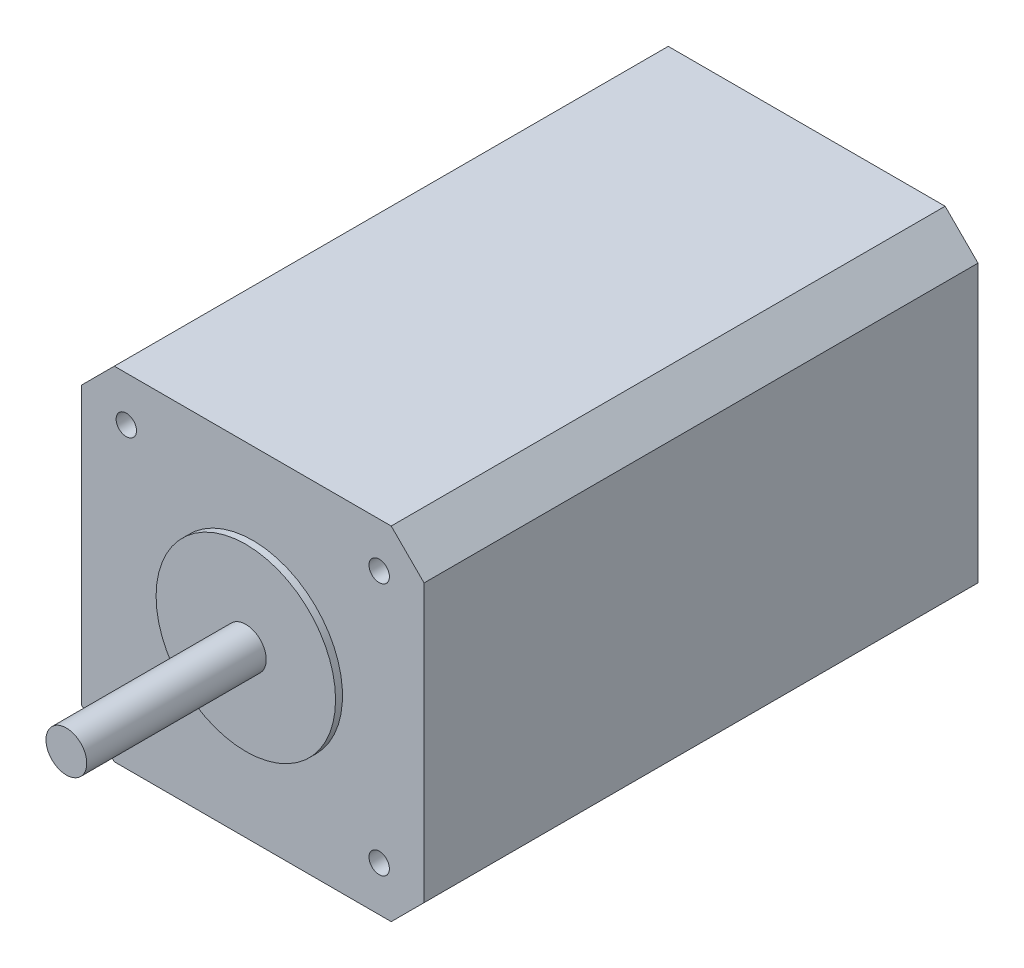
ISO-10303-21;
HEADER;
FILE_DESCRIPTION(('STEP AP214'),'2;1');
FILE_NAME('part.step','',(''),(''),'','','');
FILE_SCHEMA(('AUTOMOTIVE_DESIGN { 1 0 10303 214 1 1 1 1 }'));
ENDSEC;
DATA;
#1=APPLICATION_CONTEXT('core data for automotive mechanical design processes');
#2=APPLICATION_PROTOCOL_DEFINITION('international standard','automotive_design',2000,#1);
#3=PRODUCT_CONTEXT('',#1,'mechanical');
#4=PRODUCT('Part','Part','',(#3));
#5=PRODUCT_RELATED_PRODUCT_CATEGORY('part','',(#4));
#6=PRODUCT_DEFINITION_FORMATION('','',#4);
#7=PRODUCT_DEFINITION_CONTEXT('part definition',#1,'design');
#8=PRODUCT_DEFINITION('design','',#6,#7);
#9=PRODUCT_DEFINITION_SHAPE('','',#8);
#10=(LENGTH_UNIT() NAMED_UNIT(*) SI_UNIT(.MILLI.,.METRE.));
#11=(NAMED_UNIT(*) PLANE_ANGLE_UNIT() SI_UNIT($,.RADIAN.));
#12=(NAMED_UNIT(*) SI_UNIT($,.STERADIAN.) SOLID_ANGLE_UNIT());
#13=UNCERTAINTY_MEASURE_WITH_UNIT(LENGTH_MEASURE(1.E-05),#10,'distance_accuracy_value','');
#14=(GEOMETRIC_REPRESENTATION_CONTEXT(3) GLOBAL_UNCERTAINTY_ASSIGNED_CONTEXT((#13)) GLOBAL_UNIT_ASSIGNED_CONTEXT((#10,
#11,#12)) REPRESENTATION_CONTEXT('',''));
#15=CARTESIAN_POINT('',(0.,0.,0.));
#16=DIRECTION('',(0.,0.,1.));
#17=DIRECTION('',(1.,0.,0.));
#18=AXIS2_PLACEMENT_3D('',#15,#16,#17);
#19=CARTESIAN_POINT('',(0.,0.,33.95));
#20=DIRECTION('',(0.,0.,-1.));
#21=DIRECTION('',(-1.,0.,0.));
#22=AXIS2_PLACEMENT_3D('',#19,#20,#21);
#23=PLANE('',#22);
#24=CARTESIAN_POINT('',(-15.5,-15.5,33.95));
#25=DIRECTION('',(0.,0.,1.));
#26=DIRECTION('',(1.,0.,0.));
#27=AXIS2_PLACEMENT_3D('',#24,#25,#26);
#28=CIRCLE('',#27,1.24999999999999);
#29=CARTESIAN_POINT('',(-14.25,-15.5,33.95));
#30=VERTEX_POINT('',#29);
#31=EDGE_CURVE('E167',#30,#30,#28,.T.);
#32=ORIENTED_EDGE('',*,*,#31,.F.);
#33=EDGE_LOOP('',(#32));
#34=FACE_BOUND('',#33,.T.);
#35=CARTESIAN_POINT('',(0.,0.,33.95));
#36=DIRECTION('',(0.,0.,-1.));
#37=DIRECTION('',(-1.,0.,0.));
#38=AXIS2_PLACEMENT_3D('',#35,#36,#37);
#39=CIRCLE('',#38,11.);
#40=CARTESIAN_POINT('',(-11.,0.,33.95));
#41=VERTEX_POINT('',#40);
#42=EDGE_CURVE('E207',#41,#41,#39,.F.);
#43=ORIENTED_EDGE('',*,*,#42,.F.);
#44=EDGE_LOOP('',(#43));
#45=FACE_BOUND('',#44,.T.);
#46=DIRECTION('',(-0.707106781186552,-0.707106781186543,0.));
#47=VECTOR('',#46,1.);
#48=CARTESIAN_POINT('',(-37.9716341497178,0.,33.95));
#49=LINE('',#48,#47);
#50=CARTESIAN_POINT('',(-16.9716341497176,21.,33.95));
#51=VERTEX_POINT('',#50);
#52=CARTESIAN_POINT('',(-21.,16.9716341497176,33.95));
#53=VERTEX_POINT('',#52);
#54=EDGE_CURVE('E173',#51,#53,#49,.T.);
#55=ORIENTED_EDGE('',*,*,#54,.T.);
#56=DIRECTION('',(0.,-1.,0.));
#57=VECTOR('',#56,1.);
#58=CARTESIAN_POINT('',(-21.,-21.,33.95));
#59=LINE('',#58,#57);
#60=CARTESIAN_POINT('',(-21.,-16.9716341497176,33.95));
#61=VERTEX_POINT('',#60);
#62=EDGE_CURVE('E218',#53,#61,#59,.T.);
#63=ORIENTED_EDGE('',*,*,#62,.T.);
#64=DIRECTION('',(0.707106781186552,-0.707106781186543,0.));
#65=VECTOR('',#64,1.);
#66=CARTESIAN_POINT('',(0.,-37.9716341497174,33.95));
#67=LINE('',#66,#65);
#68=CARTESIAN_POINT('',(-16.9716341497176,-21.,33.95));
#69=VERTEX_POINT('',#68);
#70=EDGE_CURVE('E176',#61,#69,#67,.T.);
#71=ORIENTED_EDGE('',*,*,#70,.T.);
#72=DIRECTION('',(1.,0.,0.));
#73=VECTOR('',#72,1.);
#74=CARTESIAN_POINT('',(-21.,-21.,33.95));
#75=LINE('',#74,#73);
#76=CARTESIAN_POINT('',(16.9716341497176,-21.,33.95));
#77=VERTEX_POINT('',#76);
#78=EDGE_CURVE('E221',#69,#77,#75,.T.);
#79=ORIENTED_EDGE('',*,*,#78,.T.);
#80=DIRECTION('',(0.707106781186552,0.707106781186543,0.));
#81=VECTOR('',#80,1.);
#82=CARTESIAN_POINT('',(0.,-37.9716341497174,33.95));
#83=LINE('',#82,#81);
#84=CARTESIAN_POINT('',(21.,-16.9716341497176,33.95));
#85=VERTEX_POINT('',#84);
#86=EDGE_CURVE('E179',#77,#85,#83,.T.);
#87=ORIENTED_EDGE('',*,*,#86,.T.);
#88=DIRECTION('',(0.,1.,0.));
#89=VECTOR('',#88,1.);
#90=CARTESIAN_POINT('',(21.,-21.,33.95));
#91=LINE('',#90,#89);
#92=CARTESIAN_POINT('',(21.,16.9716341497176,33.95));
#93=VERTEX_POINT('',#92);
#94=EDGE_CURVE('E211',#85,#93,#91,.T.);
#95=ORIENTED_EDGE('',*,*,#94,.T.);
#96=DIRECTION('',(-0.707106781186552,0.707106781186543,0.));
#97=VECTOR('',#96,1.);
#98=CARTESIAN_POINT('',(37.9716341497178,0.,33.95));
#99=LINE('',#98,#97);
#100=CARTESIAN_POINT('',(16.9716341497176,21.,33.95));
#101=VERTEX_POINT('',#100);
#102=EDGE_CURVE('E182',#93,#101,#99,.T.);
#103=ORIENTED_EDGE('',*,*,#102,.T.);
#104=DIRECTION('',(-1.,0.,0.));
#105=VECTOR('',#104,1.);
#106=CARTESIAN_POINT('',(-21.,21.,33.95));
#107=LINE('',#106,#105);
#108=EDGE_CURVE('E214',#101,#51,#107,.T.);
#109=ORIENTED_EDGE('',*,*,#108,.T.);
#110=EDGE_LOOP('',(#55,#63,#71,#79,#87,#95,#103,#109));
#111=FACE_BOUND('',#110,.T.);
#112=CARTESIAN_POINT('',(15.5,15.5,33.95));
#113=DIRECTION('',(0.,0.,1.));
#114=DIRECTION('',(1.,0.,0.));
#115=AXIS2_PLACEMENT_3D('',#112,#113,#114);
#116=CIRCLE('',#115,1.24999999999999);
#117=CARTESIAN_POINT('',(16.75,15.5,33.95));
#118=VERTEX_POINT('',#117);
#119=EDGE_CURVE('E161',#118,#118,#116,.T.);
#120=ORIENTED_EDGE('',*,*,#119,.F.);
#121=EDGE_LOOP('',(#120));
#122=FACE_BOUND('',#121,.T.);
#123=CARTESIAN_POINT('',(15.5,-15.5,33.95));
#124=DIRECTION('',(0.,0.,1.));
#125=DIRECTION('',(1.,0.,0.));
#126=AXIS2_PLACEMENT_3D('',#123,#124,#125);
#127=CIRCLE('',#126,1.24999999999999);
#128=CARTESIAN_POINT('',(16.75,-15.5,33.95));
#129=VERTEX_POINT('',#128);
#130=EDGE_CURVE('E150',#129,#129,#127,.T.);
#131=ORIENTED_EDGE('',*,*,#130,.F.);
#132=EDGE_LOOP('',(#131));
#133=FACE_BOUND('',#132,.T.);
#134=CARTESIAN_POINT('',(-15.5,15.5,33.95));
#135=DIRECTION('',(0.,0.,1.));
#136=DIRECTION('',(1.,0.,0.));
#137=AXIS2_PLACEMENT_3D('',#134,#135,#136);
#138=CIRCLE('',#137,1.24999999999999);
#139=CARTESIAN_POINT('',(-14.25,15.5,33.95));
#140=VERTEX_POINT('',#139);
#141=EDGE_CURVE('E151',#140,#140,#138,.T.);
#142=ORIENTED_EDGE('',*,*,#141,.F.);
#143=EDGE_LOOP('',(#142));
#144=FACE_BOUND('',#143,.T.);
#145=ADVANCED_FACE('F66',(#34,#45,#111,#122,#133,#144),#23,.F.);
#146=CARTESIAN_POINT('',(21.,-21.,33.95));
#147=DIRECTION('',(-1.,0.,0.));
#148=DIRECTION('',(0.,0.,1.));
#149=AXIS2_PLACEMENT_3D('',#146,#147,#148);
#150=PLANE('',#149);
#151=DIRECTION('',(0.,0.,-1.));
#152=VECTOR('',#151,1.);
#153=CARTESIAN_POINT('',(21.,16.9716341497176,33.95));
#154=LINE('',#153,#152);
#155=CARTESIAN_POINT('',(21.,16.9716341497176,-33.95));
#156=VERTEX_POINT('',#155);
#157=EDGE_CURVE('E194',#93,#156,#154,.T.);
#158=ORIENTED_EDGE('',*,*,#157,.F.);
#159=ORIENTED_EDGE('',*,*,#94,.F.);
#160=DIRECTION('',(0.,0.,1.));
#161=VECTOR('',#160,1.);
#162=CARTESIAN_POINT('',(21.,-16.9716341497176,33.95));
#163=LINE('',#162,#161);
#164=CARTESIAN_POINT('',(21.,-16.9716341497176,-33.95));
#165=VERTEX_POINT('',#164);
#166=EDGE_CURVE('E190',#165,#85,#163,.T.);
#167=ORIENTED_EDGE('',*,*,#166,.F.);
#168=DIRECTION('',(0.,1.,0.));
#169=VECTOR('',#168,1.);
#170=CARTESIAN_POINT('',(21.,-21.,-33.95));
#171=LINE('',#170,#169);
#172=EDGE_CURVE('E210',#165,#156,#171,.T.);
#173=ORIENTED_EDGE('',*,*,#172,.T.);
#174=EDGE_LOOP('',(#158,#159,#167,#173));
#175=FACE_BOUND('',#174,.T.);
#176=ADVANCED_FACE('F68',(#175),#150,.F.);
#177=CARTESIAN_POINT('',(-21.,21.,33.95));
#178=DIRECTION('',(0.,-1.,0.));
#179=DIRECTION('',(0.,0.,-1.));
#180=AXIS2_PLACEMENT_3D('',#177,#178,#179);
#181=PLANE('',#180);
#182=DIRECTION('',(0.,0.,-1.));
#183=VECTOR('',#182,1.);
#184=CARTESIAN_POINT('',(-16.9716341497176,21.,33.95));
#185=LINE('',#184,#183);
#186=CARTESIAN_POINT('',(-16.9716341497176,21.,-33.95));
#187=VERTEX_POINT('',#186);
#188=EDGE_CURVE('E81',#51,#187,#185,.T.);
#189=ORIENTED_EDGE('',*,*,#188,.F.);
#190=ORIENTED_EDGE('',*,*,#108,.F.);
#191=DIRECTION('',(0.,0.,1.));
#192=VECTOR('',#191,1.);
#193=CARTESIAN_POINT('',(16.9716341497176,21.,33.95));
#194=LINE('',#193,#192);
#195=CARTESIAN_POINT('',(16.9716341497176,21.,-33.95));
#196=VERTEX_POINT('',#195);
#197=EDGE_CURVE('E192',#196,#101,#194,.T.);
#198=ORIENTED_EDGE('',*,*,#197,.F.);
#199=DIRECTION('',(-1.,0.,0.));
#200=VECTOR('',#199,1.);
#201=CARTESIAN_POINT('',(-21.,21.,-33.95));
#202=LINE('',#201,#200);
#203=EDGE_CURVE('E226',#196,#187,#202,.T.);
#204=ORIENTED_EDGE('',*,*,#203,.T.);
#205=EDGE_LOOP('',(#189,#190,#198,#204));
#206=FACE_BOUND('',#205,.T.);
#207=ADVANCED_FACE('F268',(#206),#181,.F.);
#208=CARTESIAN_POINT('',(-21.,-21.,33.95));
#209=DIRECTION('',(1.,0.,0.));
#210=DIRECTION('',(0.,0.,-1.));
#211=AXIS2_PLACEMENT_3D('',#208,#209,#210);
#212=PLANE('',#211);
#213=DIRECTION('',(0.,0.,1.));
#214=VECTOR('',#213,1.);
#215=CARTESIAN_POINT('',(-21.,16.9716341497176,33.95));
#216=LINE('',#215,#214);
#217=CARTESIAN_POINT('',(-21.,16.9716341497176,-33.95));
#218=VERTEX_POINT('',#217);
#219=EDGE_CURVE('E196',#218,#53,#216,.T.);
#220=ORIENTED_EDGE('',*,*,#219,.F.);
#221=DIRECTION('',(0.,-1.,0.));
#222=VECTOR('',#221,1.);
#223=CARTESIAN_POINT('',(-21.,-21.,-33.95));
#224=LINE('',#223,#222);
#225=CARTESIAN_POINT('',(-21.,-16.9716341497176,-33.95));
#226=VERTEX_POINT('',#225);
#227=EDGE_CURVE('E229',#218,#226,#224,.T.);
#228=ORIENTED_EDGE('',*,*,#227,.T.);
#229=DIRECTION('',(0.,0.,-1.));
#230=VECTOR('',#229,1.);
#231=CARTESIAN_POINT('',(-21.,-16.9716341497176,33.95));
#232=LINE('',#231,#230);
#233=EDGE_CURVE('E88',#61,#226,#232,.T.);
#234=ORIENTED_EDGE('',*,*,#233,.F.);
#235=ORIENTED_EDGE('',*,*,#62,.F.);
#236=EDGE_LOOP('',(#220,#228,#234,#235));
#237=FACE_BOUND('',#236,.T.);
#238=ADVANCED_FACE('F263',(#237),#212,.F.);
#239=CARTESIAN_POINT('',(-21.,-21.,33.95));
#240=DIRECTION('',(0.,1.,0.));
#241=DIRECTION('',(0.,0.,1.));
#242=AXIS2_PLACEMENT_3D('',#239,#240,#241);
#243=PLANE('',#242);
#244=DIRECTION('',(0.,0.,-1.));
#245=VECTOR('',#244,1.);
#246=CARTESIAN_POINT('',(16.9716341497176,-21.,33.95));
#247=LINE('',#246,#245);
#248=CARTESIAN_POINT('',(16.9716341497176,-21.,-33.95));
#249=VERTEX_POINT('',#248);
#250=EDGE_CURVE('E188',#77,#249,#247,.T.);
#251=ORIENTED_EDGE('',*,*,#250,.F.);
#252=ORIENTED_EDGE('',*,*,#78,.F.);
#253=DIRECTION('',(0.,0.,1.));
#254=VECTOR('',#253,1.);
#255=CARTESIAN_POINT('',(-16.9716341497176,-21.,33.95));
#256=LINE('',#255,#254);
#257=CARTESIAN_POINT('',(-16.9716341497176,-21.,-33.95));
#258=VERTEX_POINT('',#257);
#259=EDGE_CURVE('E185',#258,#69,#256,.T.);
#260=ORIENTED_EDGE('',*,*,#259,.F.);
#261=DIRECTION('',(1.,0.,0.));
#262=VECTOR('',#261,1.);
#263=CARTESIAN_POINT('',(-21.,-21.,-33.95));
#264=LINE('',#263,#262);
#265=EDGE_CURVE('E215',#258,#249,#264,.T.);
#266=ORIENTED_EDGE('',*,*,#265,.T.);
#267=EDGE_LOOP('',(#251,#252,#260,#266));
#268=FACE_BOUND('',#267,.T.);
#269=ADVANCED_FACE('F259',(#268),#243,.F.);
#270=CARTESIAN_POINT('',(0.,0.,-33.95));
#271=DIRECTION('',(0.,0.,-1.));
#272=DIRECTION('',(-1.,0.,0.));
#273=AXIS2_PLACEMENT_3D('',#270,#271,#272);
#274=PLANE('',#273);
#275=ORIENTED_EDGE('',*,*,#227,.F.);
#276=DIRECTION('',(0.707106781186552,0.707106781186543,0.));
#277=VECTOR('',#276,1.);
#278=CARTESIAN_POINT('',(-18.9858170748587,18.9858170748589,-33.95));
#279=LINE('',#278,#277);
#280=EDGE_CURVE('E12',#218,#187,#279,.T.);
#281=ORIENTED_EDGE('',*,*,#280,.T.);
#282=ORIENTED_EDGE('',*,*,#203,.F.);
#283=DIRECTION('',(0.707106781186552,-0.707106781186543,0.));
#284=VECTOR('',#283,1.);
#285=CARTESIAN_POINT('',(18.9858170748587,18.9858170748589,-33.95));
#286=LINE('',#285,#284);
#287=EDGE_CURVE('E74',#196,#156,#286,.T.);
#288=ORIENTED_EDGE('',*,*,#287,.T.);
#289=ORIENTED_EDGE('',*,*,#172,.F.);
#290=DIRECTION('',(-0.707106781186552,-0.707106781186544,0.));
#291=VECTOR('',#290,1.);
#292=CARTESIAN_POINT('',(18.9858170748587,-18.9858170748589,-33.95));
#293=LINE('',#292,#291);
#294=EDGE_CURVE('E237',#165,#249,#293,.T.);
#295=ORIENTED_EDGE('',*,*,#294,.T.);
#296=ORIENTED_EDGE('',*,*,#265,.F.);
#297=DIRECTION('',(-0.707106781186552,0.707106781186544,0.));
#298=VECTOR('',#297,1.);
#299=CARTESIAN_POINT('',(-18.9858170748587,-18.9858170748589,-33.95));
#300=LINE('',#299,#298);
#301=EDGE_CURVE('E206',#258,#226,#300,.T.);
#302=ORIENTED_EDGE('',*,*,#301,.T.);
#303=EDGE_LOOP('',(#275,#281,#282,#288,#289,#295,#296,#302));
#304=FACE_BOUND('',#303,.T.);
#305=ADVANCED_FACE('F244',(#304),#274,.T.);
#306=CARTESIAN_POINT('',(0.,0.,34.8));
#307=DIRECTION('',(0.,0.,-1.));
#308=DIRECTION('',(-1.,0.,0.));
#309=AXIS2_PLACEMENT_3D('',#306,#307,#308);
#310=CYLINDRICAL_SURFACE('',#309,11.);
#311=CARTESIAN_POINT('',(0.,0.,34.8));
#312=DIRECTION('',(0.,0.,1.));
#313=DIRECTION('',(1.,0.,0.));
#314=AXIS2_PLACEMENT_3D('',#311,#312,#313);
#315=CIRCLE('',#314,11.);
#316=CARTESIAN_POINT('',(11.,0.,34.8));
#317=VERTEX_POINT('',#316);
#318=EDGE_CURVE('E202',#317,#317,#315,.T.);
#319=ORIENTED_EDGE('',*,*,#318,.F.);
#320=EDGE_LOOP('',(#319));
#321=FACE_BOUND('',#320,.T.);
#322=ORIENTED_EDGE('',*,*,#42,.T.);
#323=EDGE_LOOP('',(#322));
#324=FACE_BOUND('',#323,.T.);
#325=ADVANCED_FACE('F291',(#321,#324),#310,.T.);
#326=CARTESIAN_POINT('',(0.,0.,34.8));
#327=DIRECTION('',(0.,0.,1.));
#328=DIRECTION('',(1.,0.,0.));
#329=AXIS2_PLACEMENT_3D('',#326,#327,#328);
#330=PLANE('',#329);
#331=CARTESIAN_POINT('',(0.,0.,34.8));
#332=DIRECTION('',(0.,0.,1.));
#333=DIRECTION('',(1.,0.,0.));
#334=AXIS2_PLACEMENT_3D('',#331,#332,#333);
#335=CIRCLE('',#334,2.5);
#336=CARTESIAN_POINT('',(2.5,0.,34.8));
#337=VERTEX_POINT('',#336);
#338=EDGE_CURVE('E203',#337,#337,#335,.T.);
#339=ORIENTED_EDGE('',*,*,#338,.F.);
#340=EDGE_LOOP('',(#339));
#341=FACE_BOUND('',#340,.T.);
#342=ORIENTED_EDGE('',*,*,#318,.T.);
#343=EDGE_LOOP('',(#342));
#344=FACE_BOUND('',#343,.T.);
#345=ADVANCED_FACE('F321',(#341,#344),#330,.T.);
#346=CARTESIAN_POINT('',(0.,0.,56.8));
#347=DIRECTION('',(0.,0.,-1.));
#348=DIRECTION('',(-1.,0.,0.));
#349=AXIS2_PLACEMENT_3D('',#346,#347,#348);
#350=CYLINDRICAL_SURFACE('',#349,2.5);
#351=CARTESIAN_POINT('',(0.,0.,56.8));
#352=DIRECTION('',(0.,0.,1.));
#353=DIRECTION('',(1.,0.,0.));
#354=AXIS2_PLACEMENT_3D('',#351,#352,#353);
#355=CIRCLE('',#354,2.5);
#356=CARTESIAN_POINT('',(2.5,0.,56.8));
#357=VERTEX_POINT('',#356);
#358=EDGE_CURVE('E199',#357,#357,#355,.T.);
#359=ORIENTED_EDGE('',*,*,#358,.F.);
#360=EDGE_LOOP('',(#359));
#361=FACE_BOUND('',#360,.T.);
#362=ORIENTED_EDGE('',*,*,#338,.T.);
#363=EDGE_LOOP('',(#362));
#364=FACE_BOUND('',#363,.T.);
#365=ADVANCED_FACE('F328',(#361,#364),#350,.T.);
#366=CARTESIAN_POINT('',(0.,0.,56.8));
#367=DIRECTION('',(0.,0.,1.));
#368=DIRECTION('',(1.,0.,0.));
#369=AXIS2_PLACEMENT_3D('',#366,#367,#368);
#370=PLANE('',#369);
#371=ORIENTED_EDGE('',*,*,#358,.T.);
#372=EDGE_LOOP('',(#371));
#373=FACE_BOUND('',#372,.T.);
#374=ADVANCED_FACE('F335',(#373),#370,.T.);
#375=CARTESIAN_POINT('',(0.,-37.9716341497174,-33.95));
#376=DIRECTION('',(-0.707106781186544,-0.707106781186552,0.));
#377=DIRECTION('',(0.707106781186552,-0.707106781186544,0.));
#378=AXIS2_PLACEMENT_3D('',#375,#376,#377);
#379=PLANE('',#378);
#380=ORIENTED_EDGE('',*,*,#233,.T.);
#381=ORIENTED_EDGE('',*,*,#301,.F.);
#382=ORIENTED_EDGE('',*,*,#259,.T.);
#383=ORIENTED_EDGE('',*,*,#70,.F.);
#384=EDGE_LOOP('',(#380,#381,#382,#383));
#385=FACE_BOUND('',#384,.T.);
#386=ADVANCED_FACE('F278',(#385),#379,.T.);
#387=CARTESIAN_POINT('',(0.,-37.9716341497174,-33.95));
#388=DIRECTION('',(0.707106781186544,-0.707106781186552,0.));
#389=DIRECTION('',(0.707106781186552,0.707106781186544,0.));
#390=AXIS2_PLACEMENT_3D('',#387,#388,#389);
#391=PLANE('',#390);
#392=ORIENTED_EDGE('',*,*,#166,.T.);
#393=ORIENTED_EDGE('',*,*,#86,.F.);
#394=ORIENTED_EDGE('',*,*,#250,.T.);
#395=ORIENTED_EDGE('',*,*,#294,.F.);
#396=EDGE_LOOP('',(#392,#393,#394,#395));
#397=FACE_BOUND('',#396,.T.);
#398=ADVANCED_FACE('F252',(#397),#391,.T.);
#399=CARTESIAN_POINT('',(37.9716341497178,0.,-33.95));
#400=DIRECTION('',(0.707106781186543,0.707106781186552,0.));
#401=DIRECTION('',(-0.707106781186552,0.707106781186543,0.));
#402=AXIS2_PLACEMENT_3D('',#399,#400,#401);
#403=PLANE('',#402);
#404=ORIENTED_EDGE('',*,*,#157,.T.);
#405=ORIENTED_EDGE('',*,*,#287,.F.);
#406=ORIENTED_EDGE('',*,*,#197,.T.);
#407=ORIENTED_EDGE('',*,*,#102,.F.);
#408=EDGE_LOOP('',(#404,#405,#406,#407));
#409=FACE_BOUND('',#408,.T.);
#410=ADVANCED_FACE('F269',(#409),#403,.T.);
#411=CARTESIAN_POINT('',(-37.9716341497178,0.,-33.95));
#412=DIRECTION('',(-0.707106781186543,0.707106781186552,0.));
#413=DIRECTION('',(-0.707106781186552,-0.707106781186543,0.));
#414=AXIS2_PLACEMENT_3D('',#411,#412,#413);
#415=PLANE('',#414);
#416=ORIENTED_EDGE('',*,*,#188,.T.);
#417=ORIENTED_EDGE('',*,*,#280,.F.);
#418=ORIENTED_EDGE('',*,*,#219,.T.);
#419=ORIENTED_EDGE('',*,*,#54,.F.);
#420=EDGE_LOOP('',(#416,#417,#418,#419));
#421=FACE_BOUND('',#420,.T.);
#422=ADVANCED_FACE('F265',(#421),#415,.T.);
#423=CARTESIAN_POINT('',(-15.5,-15.5,29.7010757737844));
#424=DIRECTION('',(0.,0.,1.));
#425=DIRECTION('',(1.,0.,0.));
#426=AXIS2_PLACEMENT_3D('',#423,#424,#425);
#427=CONICAL_SURFACE('',#426,1.25,1.02974425867665);
#428=CARTESIAN_POINT('',(-15.5,-15.5,28.95));
#429=VERTEX_POINT('',#428);
#430=VERTEX_LOOP('',#429);
#431=FACE_BOUND('',#430,.T.);
#432=CARTESIAN_POINT('',(-15.5,-15.5,29.7010757737844));
#433=DIRECTION('',(0.,0.,1.));
#434=DIRECTION('',(1.,0.,0.));
#435=AXIS2_PLACEMENT_3D('',#432,#433,#434);
#436=CIRCLE('',#435,1.25);
#437=CARTESIAN_POINT('',(-14.25,-15.5,29.7010757737844));
#438=VERTEX_POINT('',#437);
#439=EDGE_CURVE('E170',#438,#438,#436,.T.);
#440=ORIENTED_EDGE('',*,*,#439,.T.);
#441=EDGE_LOOP('',(#440));
#442=FACE_BOUND('',#441,.T.);
#443=ADVANCED_FACE('F276',(#431,#442),#427,.F.);
#444=CARTESIAN_POINT('',(-15.5,-15.5,33.95));
#445=DIRECTION('',(0.,0.,1.));
#446=DIRECTION('',(1.,0.,0.));
#447=AXIS2_PLACEMENT_3D('',#444,#445,#446);
#448=CYLINDRICAL_SURFACE('',#447,1.24999999999999);
#449=ORIENTED_EDGE('',*,*,#439,.F.);
#450=EDGE_LOOP('',(#449));
#451=FACE_BOUND('',#450,.T.);
#452=ORIENTED_EDGE('',*,*,#31,.T.);
#453=EDGE_LOOP('',(#452));
#454=FACE_BOUND('',#453,.T.);
#455=ADVANCED_FACE('F374',(#451,#454),#448,.F.);
#456=CARTESIAN_POINT('',(15.5,15.5,29.7010757737844));
#457=DIRECTION('',(0.,0.,1.));
#458=DIRECTION('',(1.,0.,0.));
#459=AXIS2_PLACEMENT_3D('',#456,#457,#458);
#460=CONICAL_SURFACE('',#459,1.25,1.02974425867665);
#461=CARTESIAN_POINT('',(15.5,15.5,28.95));
#462=VERTEX_POINT('',#461);
#463=VERTEX_LOOP('',#462);
#464=FACE_BOUND('',#463,.T.);
#465=CARTESIAN_POINT('',(15.5,15.5,29.7010757737844));
#466=DIRECTION('',(0.,0.,1.));
#467=DIRECTION('',(1.,0.,0.));
#468=AXIS2_PLACEMENT_3D('',#465,#466,#467);
#469=CIRCLE('',#468,1.25);
#470=CARTESIAN_POINT('',(16.75,15.5,29.7010757737844));
#471=VERTEX_POINT('',#470);
#472=EDGE_CURVE('E164',#471,#471,#469,.T.);
#473=ORIENTED_EDGE('',*,*,#472,.T.);
#474=EDGE_LOOP('',(#473));
#475=FACE_BOUND('',#474,.T.);
#476=ADVANCED_FACE('F384',(#464,#475),#460,.F.);
#477=CARTESIAN_POINT('',(15.5,15.5,33.95));
#478=DIRECTION('',(0.,0.,1.));
#479=DIRECTION('',(1.,0.,0.));
#480=AXIS2_PLACEMENT_3D('',#477,#478,#479);
#481=CYLINDRICAL_SURFACE('',#480,1.24999999999999);
#482=ORIENTED_EDGE('',*,*,#472,.F.);
#483=EDGE_LOOP('',(#482));
#484=FACE_BOUND('',#483,.T.);
#485=ORIENTED_EDGE('',*,*,#119,.T.);
#486=EDGE_LOOP('',(#485));
#487=FACE_BOUND('',#486,.T.);
#488=ADVANCED_FACE('F395',(#484,#487),#481,.F.);
#489=CARTESIAN_POINT('',(15.5,-15.5,29.7010757737844));
#490=DIRECTION('',(0.,0.,1.));
#491=DIRECTION('',(1.,0.,0.));
#492=AXIS2_PLACEMENT_3D('',#489,#490,#491);
#493=CONICAL_SURFACE('',#492,1.25,1.02974425867665);
#494=CARTESIAN_POINT('',(15.5,-15.5,28.95));
#495=VERTEX_POINT('',#494);
#496=VERTEX_LOOP('',#495);
#497=FACE_BOUND('',#496,.T.);
#498=CARTESIAN_POINT('',(15.5,-15.5,29.7010757737844));
#499=DIRECTION('',(0.,0.,1.));
#500=DIRECTION('',(1.,0.,0.));
#501=AXIS2_PLACEMENT_3D('',#498,#499,#500);
#502=CIRCLE('',#501,1.25);
#503=CARTESIAN_POINT('',(16.75,-15.5,29.7010757737844));
#504=VERTEX_POINT('',#503);
#505=EDGE_CURVE('E154',#504,#504,#502,.T.);
#506=ORIENTED_EDGE('',*,*,#505,.T.);
#507=EDGE_LOOP('',(#506));
#508=FACE_BOUND('',#507,.T.);
#509=ADVANCED_FACE('F405',(#497,#508),#493,.F.);
#510=CARTESIAN_POINT('',(15.5,-15.5,33.95));
#511=DIRECTION('',(0.,0.,1.));
#512=DIRECTION('',(1.,0.,0.));
#513=AXIS2_PLACEMENT_3D('',#510,#511,#512);
#514=CYLINDRICAL_SURFACE('',#513,1.24999999999999);
#515=ORIENTED_EDGE('',*,*,#505,.F.);
#516=EDGE_LOOP('',(#515));
#517=FACE_BOUND('',#516,.T.);
#518=ORIENTED_EDGE('',*,*,#130,.T.);
#519=EDGE_LOOP('',(#518));
#520=FACE_BOUND('',#519,.T.);
#521=ADVANCED_FACE('F144',(#517,#520),#514,.F.);
#522=CARTESIAN_POINT('',(-15.5,15.5,29.7010757737844));
#523=DIRECTION('',(0.,0.,1.));
#524=DIRECTION('',(1.,0.,0.));
#525=AXIS2_PLACEMENT_3D('',#522,#523,#524);
#526=CONICAL_SURFACE('',#525,1.25,1.02974425867665);
#527=CARTESIAN_POINT('',(-15.5,15.5,28.95));
#528=VERTEX_POINT('',#527);
#529=VERTEX_LOOP('',#528);
#530=FACE_BOUND('',#529,.T.);
#531=CARTESIAN_POINT('',(-15.5,15.5,29.7010757737844));
#532=DIRECTION('',(0.,0.,1.));
#533=DIRECTION('',(1.,0.,0.));
#534=AXIS2_PLACEMENT_3D('',#531,#532,#533);
#535=CIRCLE('',#534,1.25);
#536=CARTESIAN_POINT('',(-14.25,15.5,29.7010757737844));
#537=VERTEX_POINT('',#536);
#538=EDGE_CURVE('E148',#537,#537,#535,.T.);
#539=ORIENTED_EDGE('',*,*,#538,.T.);
#540=EDGE_LOOP('',(#539));
#541=FACE_BOUND('',#540,.T.);
#542=ADVANCED_FACE('F140',(#530,#541),#526,.F.);
#543=CARTESIAN_POINT('',(-15.5,15.5,33.95));
#544=DIRECTION('',(0.,0.,1.));
#545=DIRECTION('',(1.,0.,0.));
#546=AXIS2_PLACEMENT_3D('',#543,#544,#545);
#547=CYLINDRICAL_SURFACE('',#546,1.24999999999999);
#548=ORIENTED_EDGE('',*,*,#538,.F.);
#549=EDGE_LOOP('',(#548));
#550=FACE_BOUND('',#549,.T.);
#551=ORIENTED_EDGE('',*,*,#141,.T.);
#552=EDGE_LOOP('',(#551));
#553=FACE_BOUND('',#552,.T.);
#554=ADVANCED_FACE('F143',(#550,#553),#547,.F.);
#555=CLOSED_SHELL('',(#145,#176,#207,#238,#269,#305,#325,#345,#365,#374,#386,#398,#410,#422,
#443,#455,#476,#488,#509,#521,#542,#554));
#556=MANIFOLD_SOLID_BREP('B2',#555);
#557=ADVANCED_BREP_SHAPE_REPRESENTATION('',(#18,#556),#14);
#558=SHAPE_DEFINITION_REPRESENTATION(#9,#557);
ENDSEC;
END-ISO-10303-21;
